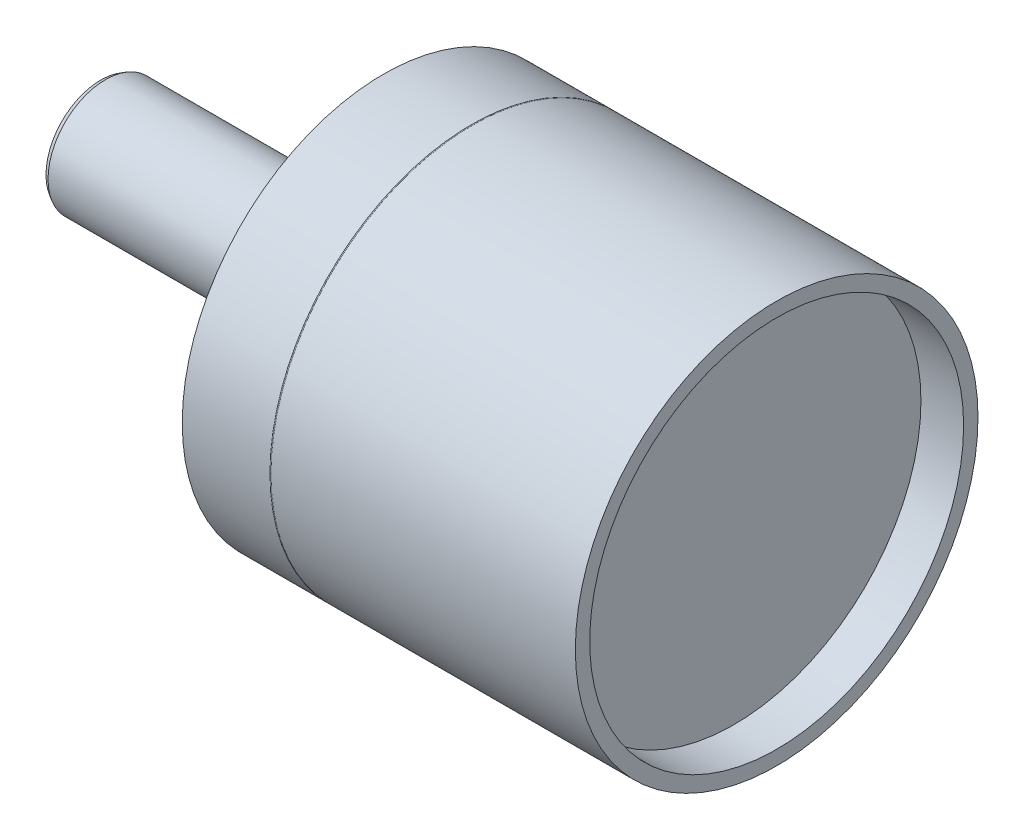
ISO-10303-21;
HEADER;
FILE_DESCRIPTION(('STEP AP214'),'2;1');
FILE_NAME('part.step','',(''),(''),'','','');
FILE_SCHEMA(('AUTOMOTIVE_DESIGN { 1 0 10303 214 1 1 1 1 }'));
ENDSEC;
DATA;
#1=APPLICATION_CONTEXT('core data for automotive mechanical design processes');
#2=APPLICATION_PROTOCOL_DEFINITION('international standard','automotive_design',2000,#1);
#3=PRODUCT_CONTEXT('',#1,'mechanical');
#4=PRODUCT('Part','Part','',(#3));
#5=PRODUCT_RELATED_PRODUCT_CATEGORY('part','',(#4));
#6=PRODUCT_DEFINITION_FORMATION('','',#4);
#7=PRODUCT_DEFINITION_CONTEXT('part definition',#1,'design');
#8=PRODUCT_DEFINITION('design','',#6,#7);
#9=PRODUCT_DEFINITION_SHAPE('','',#8);
#10=(LENGTH_UNIT() NAMED_UNIT(*) SI_UNIT(.MILLI.,.METRE.));
#11=(NAMED_UNIT(*) PLANE_ANGLE_UNIT() SI_UNIT($,.RADIAN.));
#12=(NAMED_UNIT(*) SI_UNIT($,.STERADIAN.) SOLID_ANGLE_UNIT());
#13=UNCERTAINTY_MEASURE_WITH_UNIT(LENGTH_MEASURE(1.E-05),#10,'distance_accuracy_value','');
#14=(GEOMETRIC_REPRESENTATION_CONTEXT(3) GLOBAL_UNCERTAINTY_ASSIGNED_CONTEXT((#13)) GLOBAL_UNIT_ASSIGNED_CONTEXT((#10,
#11,#12)) REPRESENTATION_CONTEXT('',''));
#15=CARTESIAN_POINT('',(0.,0.,0.));
#16=DIRECTION('',(0.,0.,1.));
#17=DIRECTION('',(1.,0.,0.));
#18=AXIS2_PLACEMENT_3D('',#15,#16,#17);
#19=CARTESIAN_POINT('',(-3.,0.,0.));
#20=DIRECTION('',(-1.,0.,0.));
#21=DIRECTION('',(0.,0.,1.));
#22=AXIS2_PLACEMENT_3D('',#19,#20,#21);
#23=PLANE('',#22);
#24=CARTESIAN_POINT('',(-3.,0.,0.));
#25=DIRECTION('',(-1.,0.,0.));
#26=DIRECTION('',(0.,0.,1.));
#27=AXIS2_PLACEMENT_3D('',#24,#25,#26);
#28=CIRCLE('',#27,14.);
#29=CARTESIAN_POINT('',(-3.,0.,14.));
#30=VERTEX_POINT('',#29);
#31=EDGE_CURVE('E200',#30,#30,#28,.T.);
#32=ORIENTED_EDGE('',*,*,#31,.T.);
#33=EDGE_LOOP('',(#32));
#34=FACE_BOUND('',#33,.T.);
#35=CARTESIAN_POINT('',(-3.,0.,0.));
#36=DIRECTION('',(-1.,0.,0.));
#37=DIRECTION('',(0.,0.,1.));
#38=AXIS2_PLACEMENT_3D('',#35,#36,#37);
#39=CIRCLE('',#38,6.);
#40=CARTESIAN_POINT('',(-3.,-5.99279677762809,-0.293916284085004));
#41=VERTEX_POINT('',#40);
#42=CARTESIAN_POINT('',(-3.,-5.99279677762809,0.293916284085002));
#43=VERTEX_POINT('',#42);
#44=EDGE_CURVE('E196',#41,#43,#39,.T.);
#45=ORIENTED_EDGE('',*,*,#44,.F.);
#46=DIRECTION('',(0.,1.,0.));
#47=VECTOR('',#46,1.);
#48=CARTESIAN_POINT('',(-3.,-5.99279677762809,-0.293916284085001));
#49=LINE('',#48,#47);
#50=CARTESIAN_POINT('',(-3.,-7.61683878137723,-0.293916284085002));
#51=VERTEX_POINT('',#50);
#52=EDGE_CURVE('E48',#51,#41,#49,.T.);
#53=ORIENTED_EDGE('',*,*,#52,.F.);
#54=CARTESIAN_POINT('',(-3.,-3.80484548733086,0.293916284084806));
#55=DIRECTION('',(-1.,0.,0.));
#56=DIRECTION('',(0.,0.,-1.));
#57=AXIS2_PLACEMENT_3D('',#54,#55,#56);
#58=CIRCLE('',#57,3.85705068699591);
#59=CARTESIAN_POINT('',(-3.,-5.99279677762799,-2.8825139690992));
#60=VERTEX_POINT('',#59);
#61=EDGE_CURVE('E52',#60,#51,#58,.T.);
#62=ORIENTED_EDGE('',*,*,#61,.F.);
#63=CARTESIAN_POINT('',(-3.,0.,0.));
#64=DIRECTION('',(-1.,0.,0.));
#65=DIRECTION('',(0.,0.,-1.));
#66=AXIS2_PLACEMENT_3D('',#63,#64,#65);
#67=CIRCLE('',#66,6.65000000000003);
#68=CARTESIAN_POINT('',(-3.,-5.99279677762799,2.88251396909925));
#69=VERTEX_POINT('',#68);
#70=EDGE_CURVE('E174',#69,#60,#67,.T.);
#71=ORIENTED_EDGE('',*,*,#70,.F.);
#72=CARTESIAN_POINT('',(-3.,-4.741805259079,0.293916284085));
#73=DIRECTION('',(-1.,0.,0.));
#74=DIRECTION('',(0.,0.,-1.));
#75=AXIS2_PLACEMENT_3D('',#72,#73,#74);
#76=CIRCLE('',#75,2.87503352229894);
#77=CARTESIAN_POINT('',(-3.,-7.616838781378,0.293916284085));
#78=VERTEX_POINT('',#77);
#79=EDGE_CURVE('E154',#78,#69,#76,.T.);
#80=ORIENTED_EDGE('',*,*,#79,.F.);
#81=DIRECTION('',(0.,-1.,0.));
#82=VECTOR('',#81,1.);
#83=CARTESIAN_POINT('',(-3.,-7.616838781378,0.293916284085));
#84=LINE('',#83,#82);
#85=EDGE_CURVE('E159',#43,#78,#84,.T.);
#86=ORIENTED_EDGE('',*,*,#85,.F.);
#87=EDGE_LOOP('',(#45,#53,#62,#71,#80,#86));
#88=FACE_BOUND('',#87,.T.);
#89=ADVANCED_FACE('F33',(#34,#88),#23,.T.);
#90=CARTESIAN_POINT('',(-29.5,0.,0.));
#91=DIRECTION('',(1.,0.,0.));
#92=DIRECTION('',(0.,0.,-1.));
#93=AXIS2_PLACEMENT_3D('',#90,#91,#92);
#94=CYLINDRICAL_SURFACE('',#93,6.);
#95=CARTESIAN_POINT('',(-29.0000000000346,0.,0.));
#96=DIRECTION('',(-1.,0.,0.));
#97=DIRECTION('',(0.,0.,1.));
#98=AXIS2_PLACEMENT_3D('',#95,#96,#97);
#99=CIRCLE('',#98,6.);
#100=CARTESIAN_POINT('',(-29.0000000000346,0.,6.));
#101=VERTEX_POINT('',#100);
#102=EDGE_CURVE('E11',#101,#101,#99,.F.);
#103=ORIENTED_EDGE('',*,*,#102,.T.);
#104=EDGE_LOOP('',(#103));
#105=FACE_BOUND('',#104,.T.);
#106=DIRECTION('',(1.,0.,0.));
#107=VECTOR('',#106,1.);
#108=CARTESIAN_POINT('',(-4.,-5.99279677762809,-0.293916284085004));
#109=LINE('',#108,#107);
#110=CARTESIAN_POINT('',(-4.,-5.99279677762809,-0.293916284085001));
#111=VERTEX_POINT('',#110);
#112=EDGE_CURVE('E185',#111,#41,#109,.T.);
#113=ORIENTED_EDGE('',*,*,#112,.T.);
#114=ORIENTED_EDGE('',*,*,#44,.T.);
#115=DIRECTION('',(1.,0.,0.));
#116=VECTOR('',#115,1.);
#117=CARTESIAN_POINT('',(-4.,-5.99279677762809,0.293916284085002));
#118=LINE('',#117,#116);
#119=CARTESIAN_POINT('',(-4.,-5.99279677762809,0.293916284085002));
#120=VERTEX_POINT('',#119);
#121=EDGE_CURVE('E182',#120,#43,#118,.T.);
#122=ORIENTED_EDGE('',*,*,#121,.F.);
#123=CARTESIAN_POINT('',(-4.,0.,0.));
#124=DIRECTION('',(1.,0.,0.));
#125=DIRECTION('',(0.,0.,1.));
#126=AXIS2_PLACEMENT_3D('',#123,#124,#125);
#127=CIRCLE('',#126,6.);
#128=EDGE_CURVE('E166',#111,#120,#127,.T.);
#129=ORIENTED_EDGE('',*,*,#128,.F.);
#130=EDGE_LOOP('',(#113,#114,#122,#129));
#131=FACE_BOUND('',#130,.T.);
#132=ADVANCED_FACE('F232',(#105,#131),#94,.T.);
#133=CARTESIAN_POINT('',(0.,21.0000000000012,0.));
#134=DIRECTION('',(-1.,0.,0.));
#135=DIRECTION('',(0.,0.,1.));
#136=AXIS2_PLACEMENT_3D('',#133,#134,#135);
#137=PLANE('',#136);
#138=CARTESIAN_POINT('',(0.,17.49999999997,3.054326190989E-05));
#139=DIRECTION('',(-1.,0.,0.));
#140=DIRECTION('',(0.,0.,1.));
#141=AXIS2_PLACEMENT_3D('',#138,#139,#140);
#142=CIRCLE('',#141,1.64999999999999);
#143=CARTESIAN_POINT('',(0.,17.49999999997,1.6500305432619));
#144=VERTEX_POINT('',#143);
#145=EDGE_CURVE('E111',#144,#144,#142,.T.);
#146=ORIENTED_EDGE('',*,*,#145,.F.);
#147=EDGE_LOOP('',(#146));
#148=FACE_BOUND('',#147,.T.);
#149=CARTESIAN_POINT('',(0.,-3.054326190881E-05,17.49999999997));
#150=DIRECTION('',(-1.,0.,0.));
#151=DIRECTION('',(0.,0.,1.));
#152=AXIS2_PLACEMENT_3D('',#149,#150,#151);
#153=CIRCLE('',#152,1.64999999999999);
#154=CARTESIAN_POINT('',(0.,-3.054326190881E-05,19.14999999997));
#155=VERTEX_POINT('',#154);
#156=EDGE_CURVE('E124',#155,#155,#153,.T.);
#157=ORIENTED_EDGE('',*,*,#156,.F.);
#158=EDGE_LOOP('',(#157));
#159=FACE_BOUND('',#158,.T.);
#160=CARTESIAN_POINT('',(0.,-17.49999999997,-3.054326190774E-05));
#161=DIRECTION('',(-1.,0.,0.));
#162=DIRECTION('',(0.,0.,1.));
#163=AXIS2_PLACEMENT_3D('',#160,#161,#162);
#164=CIRCLE('',#163,1.64999999999999);
#165=CARTESIAN_POINT('',(0.,-17.49999999997,1.64996945673808));
#166=VERTEX_POINT('',#165);
#167=EDGE_CURVE('E130',#166,#166,#164,.T.);
#168=ORIENTED_EDGE('',*,*,#167,.F.);
#169=EDGE_LOOP('',(#168));
#170=FACE_BOUND('',#169,.T.);
#171=CARTESIAN_POINT('',(0.,3.054326190667E-05,-17.49999999997));
#172=DIRECTION('',(-1.,0.,0.));
#173=DIRECTION('',(0.,0.,1.));
#174=AXIS2_PLACEMENT_3D('',#171,#172,#173);
#175=CIRCLE('',#174,1.64999999999999);
#176=CARTESIAN_POINT('',(0.,3.054326190667E-05,-15.84999999997));
#177=VERTEX_POINT('',#176);
#178=EDGE_CURVE('E136',#177,#177,#175,.T.);
#179=ORIENTED_EDGE('',*,*,#178,.F.);
#180=EDGE_LOOP('',(#179));
#181=FACE_BOUND('',#180,.T.);
#182=CARTESIAN_POINT('',(0.,18.01565088397,-7.462326931119));
#183=DIRECTION('',(-1.,0.,0.));
#184=DIRECTION('',(0.,0.,1.));
#185=AXIS2_PLACEMENT_3D('',#182,#183,#184);
#186=CIRCLE('',#185,0.74999999999999);
#187=CARTESIAN_POINT('',(0.,18.01565088397,-6.71232693111901));
#188=VERTEX_POINT('',#187);
#189=EDGE_CURVE('E142',#188,#188,#186,.T.);
#190=ORIENTED_EDGE('',*,*,#189,.F.);
#191=EDGE_LOOP('',(#190));
#192=FACE_BOUND('',#191,.T.);
#193=CARTESIAN_POINT('',(0.,1.16808307098715E-12,0.));
#194=DIRECTION('',(1.,0.,0.));
#195=DIRECTION('',(0.,0.,-1.));
#196=AXIS2_PLACEMENT_3D('',#193,#194,#195);
#197=CIRCLE('',#196,21.);
#198=CARTESIAN_POINT('',(0.,1.16808307098715E-12,-21.));
#199=VERTEX_POINT('',#198);
#200=EDGE_CURVE('E203',#199,#199,#197,.T.);
#201=ORIENTED_EDGE('',*,*,#200,.F.);
#202=EDGE_LOOP('',(#201));
#203=FACE_BOUND('',#202,.T.);
#204=CARTESIAN_POINT('',(0.,0.,0.));
#205=DIRECTION('',(-1.,0.,0.));
#206=DIRECTION('',(0.,0.,1.));
#207=AXIS2_PLACEMENT_3D('',#204,#205,#206);
#208=CIRCLE('',#207,14.);
#209=CARTESIAN_POINT('',(0.,0.,14.));
#210=VERTEX_POINT('',#209);
#211=EDGE_CURVE('E199',#210,#210,#208,.T.);
#212=ORIENTED_EDGE('',*,*,#211,.F.);
#213=EDGE_LOOP('',(#212));
#214=FACE_BOUND('',#213,.T.);
#215=ADVANCED_FACE('F238',(#148,#159,#170,#181,#192,#203,#214),#137,.T.);
#216=CARTESIAN_POINT('',(0.,1.16808307098715E-12,0.));
#217=DIRECTION('',(1.,0.,0.));
#218=DIRECTION('',(0.,0.,-1.));
#219=AXIS2_PLACEMENT_3D('',#216,#217,#218);
#220=CYLINDRICAL_SURFACE('',#219,21.);
#221=ORIENTED_EDGE('',*,*,#200,.T.);
#222=EDGE_LOOP('',(#221));
#223=FACE_BOUND('',#222,.T.);
#224=CARTESIAN_POINT('',(9.15000000000067,1.16808307098715E-12,0.));
#225=DIRECTION('',(1.,0.,0.));
#226=DIRECTION('',(0.,0.,-1.));
#227=AXIS2_PLACEMENT_3D('',#224,#225,#226);
#228=CIRCLE('',#227,21.);
#229=CARTESIAN_POINT('',(9.15000000000067,1.16808307098715E-12,-21.));
#230=VERTEX_POINT('',#229);
#231=EDGE_CURVE('E214',#230,#230,#228,.T.);
#232=ORIENTED_EDGE('',*,*,#231,.F.);
#233=EDGE_LOOP('',(#232));
#234=FACE_BOUND('',#233,.T.);
#235=ADVANCED_FACE('F250',(#223,#234),#220,.T.);
#236=CARTESIAN_POINT('',(9.20000000000034,1.16920362280837E-12,0.));
#237=DIRECTION('',(1.,0.,0.));
#238=DIRECTION('',(0.,0.,-1.));
#239=AXIS2_PLACEMENT_3D('',#236,#237,#238);
#240=TOROIDAL_SURFACE('',#239,21.0866025403794,0.100000000000672);
#241=ORIENTED_EDGE('',*,*,#231,.T.);
#242=EDGE_LOOP('',(#241));
#243=FACE_BOUND('',#242,.T.);
#244=CARTESIAN_POINT('',(9.25,1.16808307098715E-12,0.));
#245=DIRECTION('',(1.,0.,0.));
#246=DIRECTION('',(0.,0.,-1.));
#247=AXIS2_PLACEMENT_3D('',#244,#245,#246);
#248=CIRCLE('',#247,21.);
#249=CARTESIAN_POINT('',(9.25,1.16808307098715E-12,-21.));
#250=VERTEX_POINT('',#249);
#251=EDGE_CURVE('E211',#250,#250,#248,.T.);
#252=ORIENTED_EDGE('',*,*,#251,.F.);
#253=EDGE_LOOP('',(#252));
#254=FACE_BOUND('',#253,.T.);
#255=ADVANCED_FACE('F258',(#243,#254),#240,.F.);
#256=CARTESIAN_POINT('',(0.,1.16808307098715E-12,0.));
#257=DIRECTION('',(1.,0.,0.));
#258=DIRECTION('',(0.,0.,-1.));
#259=AXIS2_PLACEMENT_3D('',#256,#257,#258);
#260=CYLINDRICAL_SURFACE('',#259,21.);
#261=ORIENTED_EDGE('',*,*,#251,.T.);
#262=EDGE_LOOP('',(#261));
#263=FACE_BOUND('',#262,.T.);
#264=CARTESIAN_POINT('',(41.,1.16808307098715E-12,0.));
#265=DIRECTION('',(1.,0.,0.));
#266=DIRECTION('',(0.,0.,-1.));
#267=AXIS2_PLACEMENT_3D('',#264,#265,#266);
#268=CIRCLE('',#267,21.);
#269=CARTESIAN_POINT('',(41.,1.16808307098715E-12,-21.));
#270=VERTEX_POINT('',#269);
#271=EDGE_CURVE('E208',#270,#270,#268,.T.);
#272=ORIENTED_EDGE('',*,*,#271,.F.);
#273=EDGE_LOOP('',(#272));
#274=FACE_BOUND('',#273,.T.);
#275=ADVANCED_FACE('F254',(#263,#274),#260,.T.);
#276=CARTESIAN_POINT('',(41.,1.16808307098715E-12,0.));
#277=DIRECTION('',(1.,0.,0.));
#278=DIRECTION('',(0.,0.,-1.));
#279=AXIS2_PLACEMENT_3D('',#276,#277,#278);
#280=PLANE('',#279);
#281=CARTESIAN_POINT('',(41.,0.,0.));
#282=DIRECTION('',(1.,0.,0.));
#283=DIRECTION('',(0.,0.,-1.));
#284=AXIS2_PLACEMENT_3D('',#281,#282,#283);
#285=CIRCLE('',#284,19.5);
#286=CARTESIAN_POINT('',(41.,0.,-19.5));
#287=VERTEX_POINT('',#286);
#288=EDGE_CURVE('E148',#287,#287,#285,.T.);
#289=ORIENTED_EDGE('',*,*,#288,.F.);
#290=EDGE_LOOP('',(#289));
#291=FACE_BOUND('',#290,.T.);
#292=ORIENTED_EDGE('',*,*,#271,.T.);
#293=EDGE_LOOP('',(#292));
#294=FACE_BOUND('',#293,.T.);
#295=ADVANCED_FACE('F246',(#291,#294),#280,.T.);
#296=CARTESIAN_POINT('',(-3.,0.,0.));
#297=DIRECTION('',(1.,0.,0.));
#298=DIRECTION('',(0.,0.,-1.));
#299=AXIS2_PLACEMENT_3D('',#296,#297,#298);
#300=CYLINDRICAL_SURFACE('',#299,14.);
#301=ORIENTED_EDGE('',*,*,#31,.F.);
#302=EDGE_LOOP('',(#301));
#303=FACE_BOUND('',#302,.T.);
#304=ORIENTED_EDGE('',*,*,#211,.T.);
#305=EDGE_LOOP('',(#304));
#306=FACE_BOUND('',#305,.T.);
#307=ADVANCED_FACE('F243',(#303,#306),#300,.T.);
#308=CARTESIAN_POINT('',(-29.5,0.,0.));
#309=DIRECTION('',(-1.,0.,0.));
#310=DIRECTION('',(0.,0.,1.));
#311=AXIS2_PLACEMENT_3D('',#308,#309,#310);
#312=PLANE('',#311);
#313=CARTESIAN_POINT('',(-29.5,0.,0.));
#314=DIRECTION('',(-1.,0.,0.));
#315=DIRECTION('',(0.,0.,1.));
#316=AXIS2_PLACEMENT_3D('',#313,#314,#315);
#317=CIRCLE('',#316,5.71132486542906);
#318=CARTESIAN_POINT('',(-29.5,0.,5.71132486542906));
#319=VERTEX_POINT('',#318);
#320=EDGE_CURVE('E41',#319,#319,#317,.T.);
#321=ORIENTED_EDGE('',*,*,#320,.T.);
#322=EDGE_LOOP('',(#321));
#323=FACE_BOUND('',#322,.T.);
#324=CARTESIAN_POINT('',(-29.5,0.,0.));
#325=DIRECTION('',(-1.,0.,0.));
#326=DIRECTION('',(0.,0.,1.));
#327=AXIS2_PLACEMENT_3D('',#324,#325,#326);
#328=CIRCLE('',#327,1.32500000000846);
#329=CARTESIAN_POINT('',(-29.5,0.,1.32500000000846));
#330=VERTEX_POINT('',#329);
#331=EDGE_CURVE('E118',#330,#330,#328,.T.);
#332=ORIENTED_EDGE('',*,*,#331,.F.);
#333=EDGE_LOOP('',(#332));
#334=FACE_BOUND('',#333,.T.);
#335=ADVANCED_FACE('F219',(#323,#334),#312,.T.);
#336=CARTESIAN_POINT('',(-4.,-4.741805259079,0.293916284085));
#337=DIRECTION('',(1.,0.,0.));
#338=DIRECTION('',(0.,0.,-1.));
#339=AXIS2_PLACEMENT_3D('',#336,#337,#338);
#340=CYLINDRICAL_SURFACE('',#339,2.87503352229894);
#341=ORIENTED_EDGE('',*,*,#79,.T.);
#342=DIRECTION('',(1.,0.,0.));
#343=VECTOR('',#342,1.);
#344=CARTESIAN_POINT('',(-4.,-5.99279677762798,2.88251396909922));
#345=LINE('',#344,#343);
#346=CARTESIAN_POINT('',(-4.,-5.99279677762798,2.88251396909922));
#347=VERTEX_POINT('',#346);
#348=EDGE_CURVE('E193',#347,#69,#345,.T.);
#349=ORIENTED_EDGE('',*,*,#348,.F.);
#350=CARTESIAN_POINT('',(-4.,-4.741805259079,0.293916284085));
#351=DIRECTION('',(-1.,0.,0.));
#352=DIRECTION('',(0.,0.,-1.));
#353=AXIS2_PLACEMENT_3D('',#350,#351,#352);
#354=CIRCLE('',#353,2.87503352229894);
#355=CARTESIAN_POINT('',(-4.,-7.616838781378,0.293916284085));
#356=VERTEX_POINT('',#355);
#357=EDGE_CURVE('E155',#356,#347,#354,.T.);
#358=ORIENTED_EDGE('',*,*,#357,.F.);
#359=DIRECTION('',(1.,0.,0.));
#360=VECTOR('',#359,1.);
#361=CARTESIAN_POINT('',(-4.,-7.616838781378,0.293916284085));
#362=LINE('',#361,#360);
#363=EDGE_CURVE('E171',#356,#78,#362,.T.);
#364=ORIENTED_EDGE('',*,*,#363,.T.);
#365=EDGE_LOOP('',(#341,#349,#358,#364));
#366=FACE_BOUND('',#365,.T.);
#367=ADVANCED_FACE('F304',(#366),#340,.T.);
#368=CARTESIAN_POINT('',(-4.,0.,0.));
#369=DIRECTION('',(1.,0.,0.));
#370=DIRECTION('',(0.,0.,-1.));
#371=AXIS2_PLACEMENT_3D('',#368,#369,#370);
#372=CYLINDRICAL_SURFACE('',#371,6.65000000000003);
#373=ORIENTED_EDGE('',*,*,#70,.T.);
#374=DIRECTION('',(1.,0.,0.));
#375=VECTOR('',#374,1.);
#376=CARTESIAN_POINT('',(-4.,-5.992796777628,-2.88251396909921));
#377=LINE('',#376,#375);
#378=CARTESIAN_POINT('',(-4.,-5.992796777628,-2.88251396909921));
#379=VERTEX_POINT('',#378);
#380=EDGE_CURVE('E190',#379,#60,#377,.T.);
#381=ORIENTED_EDGE('',*,*,#380,.F.);
#382=CARTESIAN_POINT('',(-4.,0.,0.));
#383=DIRECTION('',(-1.,0.,0.));
#384=DIRECTION('',(0.,0.,-1.));
#385=AXIS2_PLACEMENT_3D('',#382,#383,#384);
#386=CIRCLE('',#385,6.65000000000003);
#387=EDGE_CURVE('E158',#347,#379,#386,.T.);
#388=ORIENTED_EDGE('',*,*,#387,.F.);
#389=ORIENTED_EDGE('',*,*,#348,.T.);
#390=EDGE_LOOP('',(#373,#381,#388,#389));
#391=FACE_BOUND('',#390,.T.);
#392=ADVANCED_FACE('F311',(#391),#372,.T.);
#393=CARTESIAN_POINT('',(-4.,-3.80484548733086,0.293916284084806));
#394=DIRECTION('',(1.,0.,0.));
#395=DIRECTION('',(0.,0.,-1.));
#396=AXIS2_PLACEMENT_3D('',#393,#394,#395);
#397=CYLINDRICAL_SURFACE('',#396,3.85705068699591);
#398=ORIENTED_EDGE('',*,*,#61,.T.);
#399=DIRECTION('',(1.,0.,0.));
#400=VECTOR('',#399,1.);
#401=CARTESIAN_POINT('',(-4.,-7.61683878137722,-0.293916284085));
#402=LINE('',#401,#400);
#403=CARTESIAN_POINT('',(-4.,-7.61683878137722,-0.293916284085));
#404=VERTEX_POINT('',#403);
#405=EDGE_CURVE('E187',#404,#51,#402,.T.);
#406=ORIENTED_EDGE('',*,*,#405,.F.);
#407=CARTESIAN_POINT('',(-4.,-3.80484548733086,0.293916284084806));
#408=DIRECTION('',(-1.,0.,0.));
#409=DIRECTION('',(0.,0.,-1.));
#410=AXIS2_PLACEMENT_3D('',#407,#408,#409);
#411=CIRCLE('',#410,3.85705068699591);
#412=EDGE_CURVE('E161',#379,#404,#411,.T.);
#413=ORIENTED_EDGE('',*,*,#412,.F.);
#414=ORIENTED_EDGE('',*,*,#380,.T.);
#415=EDGE_LOOP('',(#398,#406,#413,#414));
#416=FACE_BOUND('',#415,.T.);
#417=ADVANCED_FACE('F319',(#416),#397,.T.);
#418=CARTESIAN_POINT('',(-4.,-5.99279677762809,-0.293916284085001));
#419=DIRECTION('',(0.,0.,-1.));
#420=DIRECTION('',(0.,1.,0.));
#421=AXIS2_PLACEMENT_3D('',#418,#419,#420);
#422=PLANE('',#421);
#423=ORIENTED_EDGE('',*,*,#52,.T.);
#424=ORIENTED_EDGE('',*,*,#112,.F.);
#425=DIRECTION('',(0.,1.,0.));
#426=VECTOR('',#425,1.);
#427=CARTESIAN_POINT('',(-4.,-5.99279677762809,-0.293916284085001));
#428=LINE('',#427,#426);
#429=EDGE_CURVE('E163',#404,#111,#428,.T.);
#430=ORIENTED_EDGE('',*,*,#429,.F.);
#431=ORIENTED_EDGE('',*,*,#405,.T.);
#432=EDGE_LOOP('',(#423,#424,#430,#431));
#433=FACE_BOUND('',#432,.T.);
#434=ADVANCED_FACE('F327',(#433),#422,.F.);
#435=CARTESIAN_POINT('',(-4.,-7.616838781378,0.293916284085));
#436=DIRECTION('',(0.,0.,1.));
#437=DIRECTION('',(0.,-1.,0.));
#438=AXIS2_PLACEMENT_3D('',#435,#436,#437);
#439=PLANE('',#438);
#440=ORIENTED_EDGE('',*,*,#85,.T.);
#441=ORIENTED_EDGE('',*,*,#363,.F.);
#442=DIRECTION('',(0.,-1.,0.));
#443=VECTOR('',#442,1.);
#444=CARTESIAN_POINT('',(-4.,-7.616838781378,0.293916284085));
#445=LINE('',#444,#443);
#446=EDGE_CURVE('E169',#120,#356,#445,.T.);
#447=ORIENTED_EDGE('',*,*,#446,.F.);
#448=ORIENTED_EDGE('',*,*,#121,.T.);
#449=EDGE_LOOP('',(#440,#441,#447,#448));
#450=FACE_BOUND('',#449,.T.);
#451=ADVANCED_FACE('F335',(#450),#439,.F.);
#452=CARTESIAN_POINT('',(-4.,-4.741805259079,0.293916284085));
#453=DIRECTION('',(1.,0.,0.));
#454=DIRECTION('',(0.,0.,-1.));
#455=AXIS2_PLACEMENT_3D('',#452,#453,#454);
#456=PLANE('',#455);
#457=ORIENTED_EDGE('',*,*,#357,.T.);
#458=ORIENTED_EDGE('',*,*,#387,.T.);
#459=ORIENTED_EDGE('',*,*,#412,.T.);
#460=ORIENTED_EDGE('',*,*,#429,.T.);
#461=ORIENTED_EDGE('',*,*,#128,.T.);
#462=ORIENTED_EDGE('',*,*,#446,.T.);
#463=EDGE_LOOP('',(#457,#458,#459,#460,#461,#462));
#464=FACE_BOUND('',#463,.T.);
#465=ADVANCED_FACE('F343',(#464),#456,.F.);
#466=CARTESIAN_POINT('',(36.55,0.,0.));
#467=DIRECTION('',(-1.,0.,0.));
#468=DIRECTION('',(0.,0.,1.));
#469=AXIS2_PLACEMENT_3D('',#466,#467,#468);
#470=PLANE('',#469);
#471=CARTESIAN_POINT('',(36.55,0.,0.));
#472=DIRECTION('',(1.,0.,0.));
#473=DIRECTION('',(0.,0.,-1.));
#474=AXIS2_PLACEMENT_3D('',#471,#472,#473);
#475=CIRCLE('',#474,19.5);
#476=CARTESIAN_POINT('',(36.55,0.,-19.5));
#477=VERTEX_POINT('',#476);
#478=EDGE_CURVE('E151',#477,#477,#475,.T.);
#479=ORIENTED_EDGE('',*,*,#478,.T.);
#480=EDGE_LOOP('',(#479));
#481=FACE_BOUND('',#480,.T.);
#482=ADVANCED_FACE('F350',(#481),#470,.F.);
#483=CARTESIAN_POINT('',(41.,0.,0.));
#484=DIRECTION('',(1.,0.,0.));
#485=DIRECTION('',(0.,0.,-1.));
#486=AXIS2_PLACEMENT_3D('',#483,#484,#485);
#487=CYLINDRICAL_SURFACE('',#486,19.5);
#488=ORIENTED_EDGE('',*,*,#478,.F.);
#489=EDGE_LOOP('',(#488));
#490=FACE_BOUND('',#489,.T.);
#491=ORIENTED_EDGE('',*,*,#288,.T.);
#492=EDGE_LOOP('',(#491));
#493=FACE_BOUND('',#492,.T.);
#494=ADVANCED_FACE('F357',(#490,#493),#487,.F.);
#495=CARTESIAN_POINT('',(2.,18.01565088397,-7.462326931119));
#496=DIRECTION('',(-1.,0.,0.));
#497=DIRECTION('',(0.,0.,1.));
#498=AXIS2_PLACEMENT_3D('',#495,#496,#497);
#499=CONICAL_SURFACE('',#498,0.749999999999987,1.02974425868404);
#500=CARTESIAN_POINT('',(2.45064546426313,18.01565088397,-7.462326931119));
#501=VERTEX_POINT('',#500);
#502=VERTEX_LOOP('',#501);
#503=FACE_BOUND('',#502,.T.);
#504=CARTESIAN_POINT('',(2.,18.01565088397,-7.462326931119));
#505=DIRECTION('',(-1.,0.,0.));
#506=DIRECTION('',(0.,0.,1.));
#507=AXIS2_PLACEMENT_3D('',#504,#505,#506);
#508=CIRCLE('',#507,0.749999999999987);
#509=CARTESIAN_POINT('',(2.,18.01565088397,-6.71232693111901));
#510=VERTEX_POINT('',#509);
#511=EDGE_CURVE('E145',#510,#510,#508,.T.);
#512=ORIENTED_EDGE('',*,*,#511,.T.);
#513=EDGE_LOOP('',(#512));
#514=FACE_BOUND('',#513,.T.);
#515=ADVANCED_FACE('F365',(#503,#514),#499,.F.);
#516=CARTESIAN_POINT('',(0.,18.01565088397,-7.462326931119));
#517=DIRECTION('',(-1.,0.,0.));
#518=DIRECTION('',(0.,0.,1.));
#519=AXIS2_PLACEMENT_3D('',#516,#517,#518);
#520=CYLINDRICAL_SURFACE('',#519,0.749999999999989);
#521=ORIENTED_EDGE('',*,*,#511,.F.);
#522=EDGE_LOOP('',(#521));
#523=FACE_BOUND('',#522,.T.);
#524=ORIENTED_EDGE('',*,*,#189,.T.);
#525=EDGE_LOOP('',(#524));
#526=FACE_BOUND('',#525,.T.);
#527=ADVANCED_FACE('F373',(#523,#526),#520,.F.);
#528=CARTESIAN_POINT('',(6.00000000000001,3.054326190667E-05,-17.49999999997));
#529=DIRECTION('',(-1.,0.,0.));
#530=DIRECTION('',(0.,0.,1.));
#531=AXIS2_PLACEMENT_3D('',#528,#529,#530);
#532=CONICAL_SURFACE('',#531,1.64999999999999,1.02974425866086);
#533=CARTESIAN_POINT('',(6.99142002143094,3.05432619049576E-05,-17.49999999997));
#534=VERTEX_POINT('',#533);
#535=VERTEX_LOOP('',#534);
#536=FACE_BOUND('',#535,.T.);
#537=CARTESIAN_POINT('',(6.00000000000001,3.054326190667E-05,-17.49999999997));
#538=DIRECTION('',(-1.,0.,0.));
#539=DIRECTION('',(0.,0.,1.));
#540=AXIS2_PLACEMENT_3D('',#537,#538,#539);
#541=CIRCLE('',#540,1.64999999999999);
#542=CARTESIAN_POINT('',(6.00000000000001,3.054326190667E-05,-15.84999999997));
#543=VERTEX_POINT('',#542);
#544=EDGE_CURVE('E139',#543,#543,#541,.T.);
#545=ORIENTED_EDGE('',*,*,#544,.T.);
#546=EDGE_LOOP('',(#545));
#547=FACE_BOUND('',#546,.T.);
#548=ADVANCED_FACE('F381',(#536,#547),#532,.F.);
#549=CARTESIAN_POINT('',(0.,3.054326190667E-05,-17.49999999997));
#550=DIRECTION('',(-1.,0.,0.));
#551=DIRECTION('',(0.,0.,1.));
#552=AXIS2_PLACEMENT_3D('',#549,#550,#551);
#553=CYLINDRICAL_SURFACE('',#552,1.64999999999999);
#554=ORIENTED_EDGE('',*,*,#544,.F.);
#555=EDGE_LOOP('',(#554));
#556=FACE_BOUND('',#555,.T.);
#557=ORIENTED_EDGE('',*,*,#178,.T.);
#558=EDGE_LOOP('',(#557));
#559=FACE_BOUND('',#558,.T.);
#560=ADVANCED_FACE('F389',(#556,#559),#553,.F.);
#561=CARTESIAN_POINT('',(6.00000000000001,-17.49999999997,-3.054326190774E-05));
#562=DIRECTION('',(-1.,0.,0.));
#563=DIRECTION('',(0.,0.,1.));
#564=AXIS2_PLACEMENT_3D('',#561,#562,#563);
#565=CONICAL_SURFACE('',#564,1.64999999999999,1.02974425866086);
#566=CARTESIAN_POINT('',(6.99142002143094,-17.49999999997,-3.054326190774E-05));
#567=VERTEX_POINT('',#566);
#568=VERTEX_LOOP('',#567);
#569=FACE_BOUND('',#568,.T.);
#570=CARTESIAN_POINT('',(6.00000000000001,-17.49999999997,-3.054326190774E-05));
#571=DIRECTION('',(-1.,0.,0.));
#572=DIRECTION('',(0.,0.,1.));
#573=AXIS2_PLACEMENT_3D('',#570,#571,#572);
#574=CIRCLE('',#573,1.64999999999999);
#575=CARTESIAN_POINT('',(6.00000000000001,-17.49999999997,1.64996945673808));
#576=VERTEX_POINT('',#575);
#577=EDGE_CURVE('E133',#576,#576,#574,.T.);
#578=ORIENTED_EDGE('',*,*,#577,.T.);
#579=EDGE_LOOP('',(#578));
#580=FACE_BOUND('',#579,.T.);
#581=ADVANCED_FACE('F397',(#569,#580),#565,.F.);
#582=CARTESIAN_POINT('',(0.,-17.49999999997,-3.054326190774E-05));
#583=DIRECTION('',(-1.,0.,0.));
#584=DIRECTION('',(0.,0.,1.));
#585=AXIS2_PLACEMENT_3D('',#582,#583,#584);
#586=CYLINDRICAL_SURFACE('',#585,1.64999999999999);
#587=ORIENTED_EDGE('',*,*,#577,.F.);
#588=EDGE_LOOP('',(#587));
#589=FACE_BOUND('',#588,.T.);
#590=ORIENTED_EDGE('',*,*,#167,.T.);
#591=EDGE_LOOP('',(#590));
#592=FACE_BOUND('',#591,.T.);
#593=ADVANCED_FACE('F405',(#589,#592),#586,.F.);
#594=CARTESIAN_POINT('',(6.00000000000001,-3.054326190881E-05,17.49999999997));
#595=DIRECTION('',(-1.,0.,0.));
#596=DIRECTION('',(0.,0.,1.));
#597=AXIS2_PLACEMENT_3D('',#594,#595,#596);
#598=CONICAL_SURFACE('',#597,1.64999999999999,1.02974425866086);
#599=CARTESIAN_POINT('',(6.99142002143094,-3.05432619105224E-05,17.49999999997));
#600=VERTEX_POINT('',#599);
#601=VERTEX_LOOP('',#600);
#602=FACE_BOUND('',#601,.T.);
#603=CARTESIAN_POINT('',(6.00000000000001,-3.054326190881E-05,17.49999999997));
#604=DIRECTION('',(-1.,0.,0.));
#605=DIRECTION('',(0.,0.,1.));
#606=AXIS2_PLACEMENT_3D('',#603,#604,#605);
#607=CIRCLE('',#606,1.64999999999999);
#608=CARTESIAN_POINT('',(6.00000000000001,-3.054326190881E-05,19.14999999997));
#609=VERTEX_POINT('',#608);
#610=EDGE_CURVE('E127',#609,#609,#607,.T.);
#611=ORIENTED_EDGE('',*,*,#610,.T.);
#612=EDGE_LOOP('',(#611));
#613=FACE_BOUND('',#612,.T.);
#614=ADVANCED_FACE('F413',(#602,#613),#598,.F.);
#615=CARTESIAN_POINT('',(0.,-3.054326190881E-05,17.49999999997));
#616=DIRECTION('',(-1.,0.,0.));
#617=DIRECTION('',(0.,0.,1.));
#618=AXIS2_PLACEMENT_3D('',#615,#616,#617);
#619=CYLINDRICAL_SURFACE('',#618,1.64999999999999);
#620=ORIENTED_EDGE('',*,*,#610,.F.);
#621=EDGE_LOOP('',(#620));
#622=FACE_BOUND('',#621,.T.);
#623=ORIENTED_EDGE('',*,*,#156,.T.);
#624=EDGE_LOOP('',(#623));
#625=FACE_BOUND('',#624,.T.);
#626=ADVANCED_FACE('F421',(#622,#625),#619,.F.);
#627=CARTESIAN_POINT('',(6.00000000000001,17.49999999997,3.054326190989E-05));
#628=DIRECTION('',(-1.,0.,0.));
#629=DIRECTION('',(0.,0.,1.));
#630=AXIS2_PLACEMENT_3D('',#627,#628,#629);
#631=CONICAL_SURFACE('',#630,1.64999999999999,1.02974425866086);
#632=CARTESIAN_POINT('',(6.99142002143094,17.49999999997,3.054326190989E-05));
#633=VERTEX_POINT('',#632);
#634=VERTEX_LOOP('',#633);
#635=FACE_BOUND('',#634,.T.);
#636=CARTESIAN_POINT('',(6.00000000000001,17.49999999997,3.054326190989E-05));
#637=DIRECTION('',(-1.,0.,0.));
#638=DIRECTION('',(0.,0.,1.));
#639=AXIS2_PLACEMENT_3D('',#636,#637,#638);
#640=CIRCLE('',#639,1.64999999999999);
#641=CARTESIAN_POINT('',(6.00000000000001,17.49999999997,1.6500305432619));
#642=VERTEX_POINT('',#641);
#643=EDGE_CURVE('E115',#642,#642,#640,.T.);
#644=ORIENTED_EDGE('',*,*,#643,.T.);
#645=EDGE_LOOP('',(#644));
#646=FACE_BOUND('',#645,.T.);
#647=ADVANCED_FACE('F429',(#635,#646),#631,.F.);
#648=CARTESIAN_POINT('',(0.,17.49999999997,3.054326190989E-05));
#649=DIRECTION('',(-1.,0.,0.));
#650=DIRECTION('',(0.,0.,1.));
#651=AXIS2_PLACEMENT_3D('',#648,#649,#650);
#652=CYLINDRICAL_SURFACE('',#651,1.64999999999999);
#653=ORIENTED_EDGE('',*,*,#643,.F.);
#654=EDGE_LOOP('',(#653));
#655=FACE_BOUND('',#654,.T.);
#656=ORIENTED_EDGE('',*,*,#145,.T.);
#657=EDGE_LOOP('',(#656));
#658=FACE_BOUND('',#657,.T.);
#659=ADVANCED_FACE('F105',(#655,#658),#652,.F.);
#660=CARTESIAN_POINT('',(-27.5608439182555,0.,0.));
#661=DIRECTION('',(-1.,0.,0.));
#662=DIRECTION('',(0.,0.,1.));
#663=AXIS2_PLACEMENT_3D('',#660,#661,#662);
#664=CONICAL_SURFACE('',#663,0.62500000001363,1.04719755117748);
#665=CARTESIAN_POINT('',(-27.1999999999881,0.,0.));
#666=VERTEX_POINT('',#665);
#667=VERTEX_LOOP('',#666);
#668=FACE_BOUND('',#667,.T.);
#669=CARTESIAN_POINT('',(-27.5608439182555,0.,0.));
#670=DIRECTION('',(-1.,0.,0.));
#671=DIRECTION('',(0.,0.,1.));
#672=AXIS2_PLACEMENT_3D('',#669,#670,#671);
#673=CIRCLE('',#672,0.62500000001363);
#674=CARTESIAN_POINT('',(-27.5608439182555,0.,0.62500000001363));
#675=VERTEX_POINT('',#674);
#676=EDGE_CURVE('E109',#675,#675,#673,.T.);
#677=ORIENTED_EDGE('',*,*,#676,.T.);
#678=EDGE_LOOP('',(#677));
#679=FACE_BOUND('',#678,.T.);
#680=ADVANCED_FACE('F101',(#668,#679),#664,.F.);
#681=CARTESIAN_POINT('',(-29.5,0.,0.));
#682=DIRECTION('',(-1.,0.,0.));
#683=DIRECTION('',(0.,0.,1.));
#684=AXIS2_PLACEMENT_3D('',#681,#682,#683);
#685=CYLINDRICAL_SURFACE('',#684,0.625000000013631);
#686=ORIENTED_EDGE('',*,*,#676,.F.);
#687=EDGE_LOOP('',(#686));
#688=FACE_BOUND('',#687,.T.);
#689=CARTESIAN_POINT('',(-28.2875644346786,0.,0.));
#690=DIRECTION('',(-1.,0.,0.));
#691=DIRECTION('',(0.,0.,1.));
#692=AXIS2_PLACEMENT_3D('',#689,#690,#691);
#693=CIRCLE('',#692,0.625000000013632);
#694=CARTESIAN_POINT('',(-28.2875644346786,0.,0.625000000013632));
#695=VERTEX_POINT('',#694);
#696=EDGE_CURVE('E112',#695,#695,#693,.T.);
#697=ORIENTED_EDGE('',*,*,#696,.T.);
#698=EDGE_LOOP('',(#697));
#699=FACE_BOUND('',#698,.T.);
#700=ADVANCED_FACE('F104',(#688,#699),#685,.F.);
#701=CARTESIAN_POINT('',(-29.5,0.,0.));
#702=DIRECTION('',(-1.,0.,0.));
#703=DIRECTION('',(0.,0.,1.));
#704=AXIS2_PLACEMENT_3D('',#701,#702,#703);
#705=CONICAL_SURFACE('',#704,1.32500000000846,0.523598775586827);
#706=ORIENTED_EDGE('',*,*,#696,.F.);
#707=EDGE_LOOP('',(#706));
#708=FACE_BOUND('',#707,.T.);
#709=ORIENTED_EDGE('',*,*,#331,.T.);
#710=EDGE_LOOP('',(#709));
#711=FACE_BOUND('',#710,.T.);
#712=ADVANCED_FACE('F223',(#708,#711),#705,.F.);
#713=CARTESIAN_POINT('',(-29.5,0.,0.));
#714=DIRECTION('',(1.,0.,0.));
#715=DIRECTION('',(0.,0.,-1.));
#716=AXIS2_PLACEMENT_3D('',#713,#714,#715);
#717=CONICAL_SURFACE('',#716,5.71132486542906,0.523598775592442);
#718=ORIENTED_EDGE('',*,*,#102,.F.);
#719=EDGE_LOOP('',(#718));
#720=FACE_BOUND('',#719,.T.);
#721=ORIENTED_EDGE('',*,*,#320,.F.);
#722=EDGE_LOOP('',(#721));
#723=FACE_BOUND('',#722,.T.);
#724=ADVANCED_FACE('F35',(#720,#723),#717,.T.);
#725=CLOSED_SHELL('',(#89,#132,#215,#235,#255,#275,#295,#307,#335,#367,#392,#417,#434,#451,#465,
#482,#494,#515,#527,#548,#560,#581,#593,#614,#626,#647,#659,#680,#700,#712,#724));
#726=MANIFOLD_SOLID_BREP('B2',#725);
#727=ADVANCED_BREP_SHAPE_REPRESENTATION('',(#18,#726),#14);
#728=SHAPE_DEFINITION_REPRESENTATION(#9,#727);
ENDSEC;
END-ISO-10303-21;
